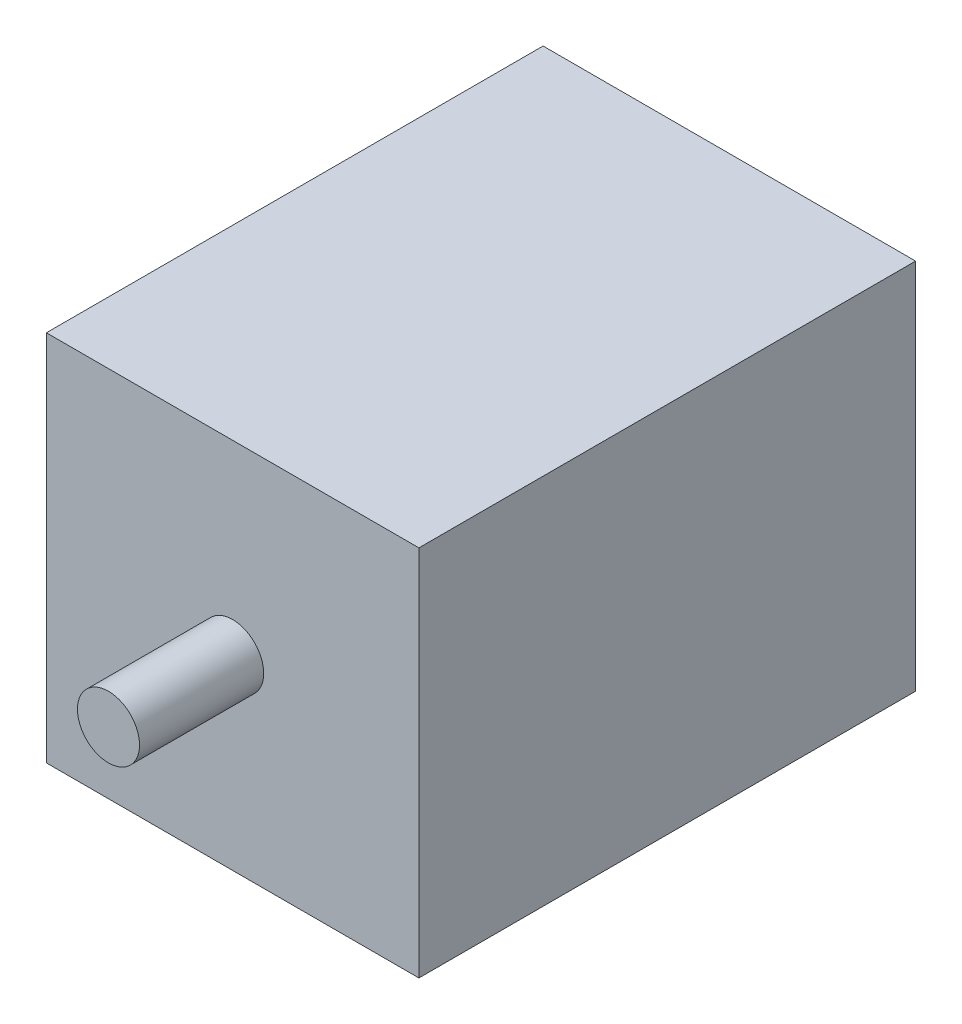
ISO-10303-21;
HEADER;
FILE_DESCRIPTION(('STEP AP214'),'2;1');
FILE_NAME('part.step','',(''),(''),'','','');
FILE_SCHEMA(('AUTOMOTIVE_DESIGN { 1 0 10303 214 1 1 1 1 }'));
ENDSEC;
DATA;
#1=APPLICATION_CONTEXT('core data for automotive mechanical design processes');
#2=APPLICATION_PROTOCOL_DEFINITION('international standard','automotive_design',2000,#1);
#3=PRODUCT_CONTEXT('',#1,'mechanical');
#4=PRODUCT('Part','Part','',(#3));
#5=PRODUCT_RELATED_PRODUCT_CATEGORY('part','',(#4));
#6=PRODUCT_DEFINITION_FORMATION('','',#4);
#7=PRODUCT_DEFINITION_CONTEXT('part definition',#1,'design');
#8=PRODUCT_DEFINITION('design','',#6,#7);
#9=PRODUCT_DEFINITION_SHAPE('','',#8);
#10=(LENGTH_UNIT() NAMED_UNIT(*) SI_UNIT(.MILLI.,.METRE.));
#11=(NAMED_UNIT(*) PLANE_ANGLE_UNIT() SI_UNIT($,.RADIAN.));
#12=(NAMED_UNIT(*) SI_UNIT($,.STERADIAN.) SOLID_ANGLE_UNIT());
#13=UNCERTAINTY_MEASURE_WITH_UNIT(LENGTH_MEASURE(1.E-05),#10,'distance_accuracy_value','');
#14=(GEOMETRIC_REPRESENTATION_CONTEXT(3) GLOBAL_UNCERTAINTY_ASSIGNED_CONTEXT((#13)) GLOBAL_UNIT_ASSIGNED_CONTEXT((#10,
#11,#12)) REPRESENTATION_CONTEXT('',''));
#15=CARTESIAN_POINT('',(0.,0.,0.));
#16=DIRECTION('',(0.,0.,1.));
#17=DIRECTION('',(1.,0.,0.));
#18=AXIS2_PLACEMENT_3D('',#15,#16,#17);
#19=CARTESIAN_POINT('',(19.05,-19.05,25.4));
#20=DIRECTION('',(-1.,0.,0.));
#21=DIRECTION('',(0.,0.,1.));
#22=AXIS2_PLACEMENT_3D('',#19,#20,#21);
#23=PLANE('',#22);
#24=DIRECTION('',(0.,1.,0.));
#25=VECTOR('',#24,1.);
#26=CARTESIAN_POINT('',(19.05,-19.05,-25.4));
#27=LINE('',#26,#25);
#28=CARTESIAN_POINT('',(19.05,-19.05,-25.4));
#29=VERTEX_POINT('',#28);
#30=CARTESIAN_POINT('',(19.05,19.05,-25.4));
#31=VERTEX_POINT('',#30);
#32=EDGE_CURVE('E100',#29,#31,#27,.T.);
#33=ORIENTED_EDGE('',*,*,#32,.T.);
#34=DIRECTION('',(0.,0.,-1.));
#35=VECTOR('',#34,1.);
#36=CARTESIAN_POINT('',(19.05,19.05,25.4));
#37=LINE('',#36,#35);
#38=CARTESIAN_POINT('',(19.05,19.05,25.4));
#39=VERTEX_POINT('',#38);
#40=EDGE_CURVE('E42',#39,#31,#37,.T.);
#41=ORIENTED_EDGE('',*,*,#40,.F.);
#42=DIRECTION('',(0.,1.,0.));
#43=VECTOR('',#42,1.);
#44=CARTESIAN_POINT('',(19.05,-19.05,25.4));
#45=LINE('',#44,#43);
#46=CARTESIAN_POINT('',(19.05,-19.05,25.4));
#47=VERTEX_POINT('',#46);
#48=EDGE_CURVE('E86',#47,#39,#45,.T.);
#49=ORIENTED_EDGE('',*,*,#48,.F.);
#50=DIRECTION('',(0.,0.,-1.));
#51=VECTOR('',#50,1.);
#52=CARTESIAN_POINT('',(19.05,-19.05,25.4));
#53=LINE('',#52,#51);
#54=EDGE_CURVE('E96',#47,#29,#53,.T.);
#55=ORIENTED_EDGE('',*,*,#54,.T.);
#56=EDGE_LOOP('',(#33,#41,#49,#55));
#57=FACE_BOUND('',#56,.T.);
#58=ADVANCED_FACE('F34',(#57),#23,.F.);
#59=CARTESIAN_POINT('',(-19.05,19.05,25.4));
#60=DIRECTION('',(0.,-1.,0.));
#61=DIRECTION('',(0.,0.,-1.));
#62=AXIS2_PLACEMENT_3D('',#59,#60,#61);
#63=PLANE('',#62);
#64=DIRECTION('',(-1.,0.,0.));
#65=VECTOR('',#64,1.);
#66=CARTESIAN_POINT('',(-19.05,19.05,-25.4));
#67=LINE('',#66,#65);
#68=CARTESIAN_POINT('',(-19.05,19.05,-25.4));
#69=VERTEX_POINT('',#68);
#70=EDGE_CURVE('E91',#31,#69,#67,.T.);
#71=ORIENTED_EDGE('',*,*,#70,.T.);
#72=DIRECTION('',(0.,0.,-1.));
#73=VECTOR('',#72,1.);
#74=CARTESIAN_POINT('',(-19.05,19.05,25.4));
#75=LINE('',#74,#73);
#76=CARTESIAN_POINT('',(-19.05,19.05,25.4));
#77=VERTEX_POINT('',#76);
#78=EDGE_CURVE('E89',#77,#69,#75,.T.);
#79=ORIENTED_EDGE('',*,*,#78,.F.);
#80=DIRECTION('',(-1.,0.,0.));
#81=VECTOR('',#80,1.);
#82=CARTESIAN_POINT('',(-19.05,19.05,25.4));
#83=LINE('',#82,#81);
#84=EDGE_CURVE('E81',#39,#77,#83,.T.);
#85=ORIENTED_EDGE('',*,*,#84,.F.);
#86=ORIENTED_EDGE('',*,*,#40,.T.);
#87=EDGE_LOOP('',(#71,#79,#85,#86));
#88=FACE_BOUND('',#87,.T.);
#89=ADVANCED_FACE('F90',(#88),#63,.F.);
#90=CARTESIAN_POINT('',(-19.05,-19.05,25.4));
#91=DIRECTION('',(1.,0.,0.));
#92=DIRECTION('',(0.,0.,-1.));
#93=AXIS2_PLACEMENT_3D('',#90,#91,#92);
#94=PLANE('',#93);
#95=DIRECTION('',(0.,-1.,0.));
#96=VECTOR('',#95,1.);
#97=CARTESIAN_POINT('',(-19.05,-19.05,-25.4));
#98=LINE('',#97,#96);
#99=CARTESIAN_POINT('',(-19.05,-19.05,-25.4));
#100=VERTEX_POINT('',#99);
#101=EDGE_CURVE('E67',#69,#100,#98,.T.);
#102=ORIENTED_EDGE('',*,*,#101,.T.);
#103=DIRECTION('',(0.,0.,-1.));
#104=VECTOR('',#103,1.);
#105=CARTESIAN_POINT('',(-19.05,-19.05,25.4));
#106=LINE('',#105,#104);
#107=CARTESIAN_POINT('',(-19.05,-19.05,25.4));
#108=VERTEX_POINT('',#107);
#109=EDGE_CURVE('E92',#108,#100,#106,.T.);
#110=ORIENTED_EDGE('',*,*,#109,.F.);
#111=DIRECTION('',(0.,-1.,0.));
#112=VECTOR('',#111,1.);
#113=CARTESIAN_POINT('',(-19.05,-19.05,25.4));
#114=LINE('',#113,#112);
#115=EDGE_CURVE('E84',#77,#108,#114,.T.);
#116=ORIENTED_EDGE('',*,*,#115,.F.);
#117=ORIENTED_EDGE('',*,*,#78,.T.);
#118=EDGE_LOOP('',(#102,#110,#116,#117));
#119=FACE_BOUND('',#118,.T.);
#120=ADVANCED_FACE('F94',(#119),#94,.F.);
#121=CARTESIAN_POINT('',(-19.05,-19.05,25.4));
#122=DIRECTION('',(0.,1.,0.));
#123=DIRECTION('',(0.,0.,1.));
#124=AXIS2_PLACEMENT_3D('',#121,#122,#123);
#125=PLANE('',#124);
#126=DIRECTION('',(1.,0.,0.));
#127=VECTOR('',#126,1.);
#128=CARTESIAN_POINT('',(-19.05,-19.05,-25.4));
#129=LINE('',#128,#127);
#130=EDGE_CURVE('E73',#100,#29,#129,.T.);
#131=ORIENTED_EDGE('',*,*,#130,.T.);
#132=ORIENTED_EDGE('',*,*,#54,.F.);
#133=DIRECTION('',(1.,0.,0.));
#134=VECTOR('',#133,1.);
#135=CARTESIAN_POINT('',(-19.05,-19.05,25.4));
#136=LINE('',#135,#134);
#137=EDGE_CURVE('E50',#108,#47,#136,.T.);
#138=ORIENTED_EDGE('',*,*,#137,.F.);
#139=ORIENTED_EDGE('',*,*,#109,.T.);
#140=EDGE_LOOP('',(#131,#132,#138,#139));
#141=FACE_BOUND('',#140,.T.);
#142=ADVANCED_FACE('F122',(#141),#125,.F.);
#143=CARTESIAN_POINT('',(0.,0.,25.4));
#144=DIRECTION('',(0.,0.,-1.));
#145=DIRECTION('',(-1.,0.,0.));
#146=AXIS2_PLACEMENT_3D('',#143,#144,#145);
#147=PLANE('',#146);
#148=CARTESIAN_POINT('',(0.,0.,25.4));
#149=DIRECTION('',(0.,0.,-1.));
#150=DIRECTION('',(-1.,0.,0.));
#151=AXIS2_PLACEMENT_3D('',#148,#149,#150);
#152=CIRCLE('',#151,3.175);
#153=CARTESIAN_POINT('',(-3.175,0.,25.4));
#154=VERTEX_POINT('',#153);
#155=EDGE_CURVE('E11',#154,#154,#152,.F.);
#156=ORIENTED_EDGE('',*,*,#155,.F.);
#157=EDGE_LOOP('',(#156));
#158=FACE_BOUND('',#157,.T.);
#159=ORIENTED_EDGE('',*,*,#48,.T.);
#160=ORIENTED_EDGE('',*,*,#84,.T.);
#161=ORIENTED_EDGE('',*,*,#115,.T.);
#162=ORIENTED_EDGE('',*,*,#137,.T.);
#163=EDGE_LOOP('',(#159,#160,#161,#162));
#164=FACE_BOUND('',#163,.T.);
#165=ADVANCED_FACE('F82',(#158,#164),#147,.F.);
#166=CARTESIAN_POINT('',(0.,0.,-25.4));
#167=DIRECTION('',(0.,0.,-1.));
#168=DIRECTION('',(-1.,0.,0.));
#169=AXIS2_PLACEMENT_3D('',#166,#167,#168);
#170=PLANE('',#169);
#171=ORIENTED_EDGE('',*,*,#32,.F.);
#172=ORIENTED_EDGE('',*,*,#130,.F.);
#173=ORIENTED_EDGE('',*,*,#101,.F.);
#174=ORIENTED_EDGE('',*,*,#70,.F.);
#175=EDGE_LOOP('',(#171,#172,#173,#174));
#176=FACE_BOUND('',#175,.T.);
#177=ADVANCED_FACE('F111',(#176),#170,.T.);
#178=CARTESIAN_POINT('',(0.,0.,38.1));
#179=DIRECTION('',(0.,0.,-1.));
#180=DIRECTION('',(-1.,0.,0.));
#181=AXIS2_PLACEMENT_3D('',#178,#179,#180);
#182=CYLINDRICAL_SURFACE('',#181,3.175);
#183=CARTESIAN_POINT('',(0.,0.,38.1));
#184=DIRECTION('',(0.,0.,1.));
#185=DIRECTION('',(1.,0.,0.));
#186=AXIS2_PLACEMENT_3D('',#183,#184,#185);
#187=CIRCLE('',#186,3.175);
#188=CARTESIAN_POINT('',(3.175,0.,38.1));
#189=VERTEX_POINT('',#188);
#190=EDGE_CURVE('E103',#189,#189,#187,.T.);
#191=ORIENTED_EDGE('',*,*,#190,.F.);
#192=EDGE_LOOP('',(#191));
#193=FACE_BOUND('',#192,.T.);
#194=ORIENTED_EDGE('',*,*,#155,.T.);
#195=EDGE_LOOP('',(#194));
#196=FACE_BOUND('',#195,.T.);
#197=ADVANCED_FACE('F113',(#193,#196),#182,.T.);
#198=CARTESIAN_POINT('',(0.,0.,38.1));
#199=DIRECTION('',(0.,0.,1.));
#200=DIRECTION('',(1.,0.,0.));
#201=AXIS2_PLACEMENT_3D('',#198,#199,#200);
#202=PLANE('',#201);
#203=ORIENTED_EDGE('',*,*,#190,.T.);
#204=EDGE_LOOP('',(#203));
#205=FACE_BOUND('',#204,.T.);
#206=ADVANCED_FACE('F119',(#205),#202,.T.);
#207=CLOSED_SHELL('',(#58,#89,#120,#142,#165,#177,#197,#206));
#208=MANIFOLD_SOLID_BREP('B2',#207);
#209=ADVANCED_BREP_SHAPE_REPRESENTATION('',(#18,#208),#14);
#210=SHAPE_DEFINITION_REPRESENTATION(#9,#209);
ENDSEC;
END-ISO-10303-21;
